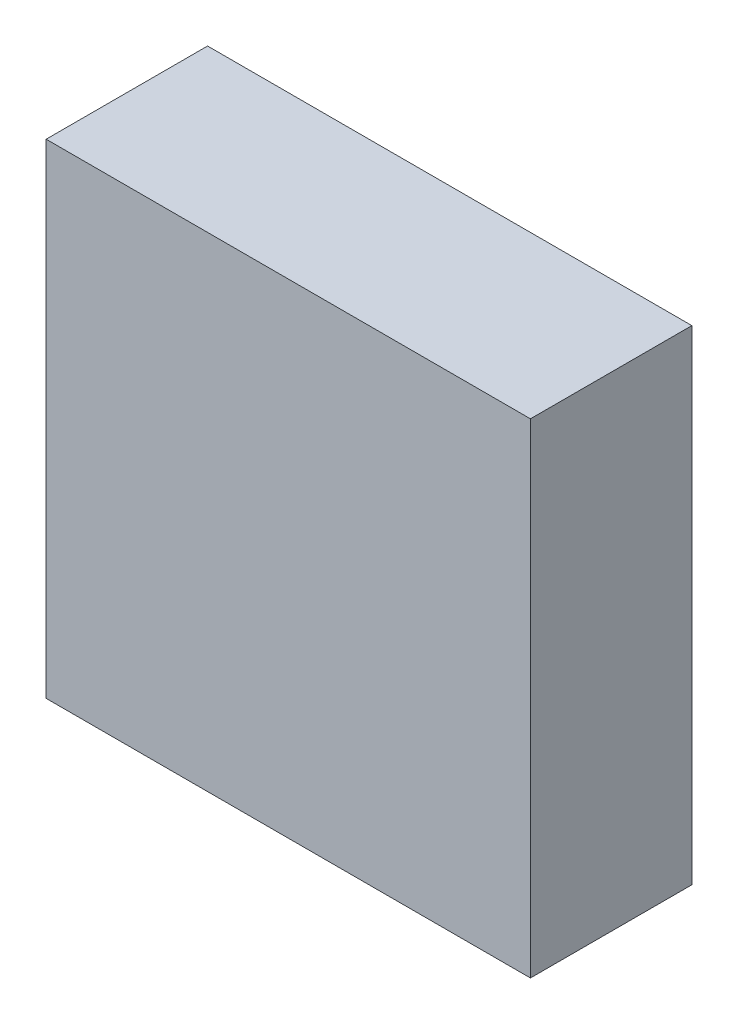
ISO-10303-21;
HEADER;
FILE_DESCRIPTION(('STEP AP214'),'2;1');
FILE_NAME('part.step','',(''),(''),'','','');
FILE_SCHEMA(('AUTOMOTIVE_DESIGN { 1 0 10303 214 1 1 1 1 }'));
ENDSEC;
DATA;
#1=APPLICATION_CONTEXT('core data for automotive mechanical design processes');
#2=APPLICATION_PROTOCOL_DEFINITION('international standard','automotive_design',2000,#1);
#3=PRODUCT_CONTEXT('',#1,'mechanical');
#4=PRODUCT('Part','Part','',(#3));
#5=PRODUCT_RELATED_PRODUCT_CATEGORY('part','',(#4));
#6=PRODUCT_DEFINITION_FORMATION('','',#4);
#7=PRODUCT_DEFINITION_CONTEXT('part definition',#1,'design');
#8=PRODUCT_DEFINITION('design','',#6,#7);
#9=PRODUCT_DEFINITION_SHAPE('','',#8);
#10=(LENGTH_UNIT() NAMED_UNIT(*) SI_UNIT(.MILLI.,.METRE.));
#11=(NAMED_UNIT(*) PLANE_ANGLE_UNIT() SI_UNIT($,.RADIAN.));
#12=(NAMED_UNIT(*) SI_UNIT($,.STERADIAN.) SOLID_ANGLE_UNIT());
#13=UNCERTAINTY_MEASURE_WITH_UNIT(LENGTH_MEASURE(1.E-05),#10,'distance_accuracy_value','');
#14=(GEOMETRIC_REPRESENTATION_CONTEXT(3) GLOBAL_UNCERTAINTY_ASSIGNED_CONTEXT((#13)) GLOBAL_UNIT_ASSIGNED_CONTEXT((#10,
#11,#12)) REPRESENTATION_CONTEXT('',''));
#15=CARTESIAN_POINT('',(0.,0.,0.));
#16=DIRECTION('',(0.,0.,1.));
#17=DIRECTION('',(1.,0.,0.));
#18=AXIS2_PLACEMENT_3D('',#15,#16,#17);
#19=CARTESIAN_POINT('',(-228.197674418605,20.7848837209302,100.));
#20=DIRECTION('',(1.,0.,0.));
#21=DIRECTION('',(0.,1.,0.));
#22=AXIS2_PLACEMENT_3D('',#19,#20,#21);
#23=PLANE('',#22);
#24=DIRECTION('',(0.,-1.,0.));
#25=VECTOR('',#24,1.);
#26=CARTESIAN_POINT('',(-228.197674418605,20.7848837209302,0.));
#27=LINE('',#26,#25);
#28=CARTESIAN_POINT('',(-228.197674418605,20.7848837209302,0.));
#29=VERTEX_POINT('',#28);
#30=CARTESIAN_POINT('',(-228.197674418605,-279.21511627907,0.));
#31=VERTEX_POINT('',#30);
#32=EDGE_CURVE('E102',#29,#31,#27,.T.);
#33=ORIENTED_EDGE('',*,*,#32,.T.);
#34=DIRECTION('',(0.,0.,-1.));
#35=VECTOR('',#34,1.);
#36=CARTESIAN_POINT('',(-228.197674418605,-279.21511627907,100.));
#37=LINE('',#36,#35);
#38=CARTESIAN_POINT('',(-228.197674418605,-279.21511627907,100.));
#39=VERTEX_POINT('',#38);
#40=EDGE_CURVE('E11',#39,#31,#37,.T.);
#41=ORIENTED_EDGE('',*,*,#40,.F.);
#42=DIRECTION('',(0.,-1.,0.));
#43=VECTOR('',#42,1.);
#44=CARTESIAN_POINT('',(-228.197674418605,20.7848837209302,100.));
#45=LINE('',#44,#43);
#46=CARTESIAN_POINT('',(-228.197674418605,20.7848837209302,100.));
#47=VERTEX_POINT('',#46);
#48=EDGE_CURVE('E90',#47,#39,#45,.T.);
#49=ORIENTED_EDGE('',*,*,#48,.F.);
#50=DIRECTION('',(0.,0.,-1.));
#51=VECTOR('',#50,1.);
#52=CARTESIAN_POINT('',(-228.197674418605,20.7848837209302,100.));
#53=LINE('',#52,#51);
#54=EDGE_CURVE('E98',#47,#29,#53,.T.);
#55=ORIENTED_EDGE('',*,*,#54,.T.);
#56=EDGE_LOOP('',(#33,#41,#49,#55));
#57=FACE_BOUND('',#56,.T.);
#58=ADVANCED_FACE('F39',(#57),#23,.F.);
#59=CARTESIAN_POINT('',(-228.197674418605,-279.21511627907,100.));
#60=DIRECTION('',(0.,1.,0.));
#61=DIRECTION('',(0.,0.,1.));
#62=AXIS2_PLACEMENT_3D('',#59,#60,#61);
#63=PLANE('',#62);
#64=DIRECTION('',(1.,0.,0.));
#65=VECTOR('',#64,1.);
#66=CARTESIAN_POINT('',(-228.197674418605,-279.21511627907,0.));
#67=LINE('',#66,#65);
#68=CARTESIAN_POINT('',(71.8023255813954,-279.21511627907,0.));
#69=VERTEX_POINT('',#68);
#70=EDGE_CURVE('E94',#31,#69,#67,.T.);
#71=ORIENTED_EDGE('',*,*,#70,.T.);
#72=DIRECTION('',(0.,0.,-1.));
#73=VECTOR('',#72,1.);
#74=CARTESIAN_POINT('',(71.8023255813954,-279.21511627907,100.));
#75=LINE('',#74,#73);
#76=CARTESIAN_POINT('',(71.8023255813954,-279.21511627907,100.));
#77=VERTEX_POINT('',#76);
#78=EDGE_CURVE('E47',#77,#69,#75,.T.);
#79=ORIENTED_EDGE('',*,*,#78,.F.);
#80=DIRECTION('',(1.,0.,0.));
#81=VECTOR('',#80,1.);
#82=CARTESIAN_POINT('',(-228.197674418605,-279.21511627907,100.));
#83=LINE('',#82,#81);
#84=EDGE_CURVE('E85',#39,#77,#83,.T.);
#85=ORIENTED_EDGE('',*,*,#84,.F.);
#86=ORIENTED_EDGE('',*,*,#40,.T.);
#87=EDGE_LOOP('',(#71,#79,#85,#86));
#88=FACE_BOUND('',#87,.T.);
#89=ADVANCED_FACE('F93',(#88),#63,.F.);
#90=CARTESIAN_POINT('',(71.8023255813954,20.7848837209302,100.));
#91=DIRECTION('',(-1.,0.,0.));
#92=DIRECTION('',(0.,-1.,0.));
#93=AXIS2_PLACEMENT_3D('',#90,#91,#92);
#94=PLANE('',#93);
#95=DIRECTION('',(0.,1.,0.));
#96=VECTOR('',#95,1.);
#97=CARTESIAN_POINT('',(71.8023255813954,20.7848837209302,0.));
#98=LINE('',#97,#96);
#99=CARTESIAN_POINT('',(71.8023255813954,20.7848837209302,0.));
#100=VERTEX_POINT('',#99);
#101=EDGE_CURVE('E72',#69,#100,#98,.T.);
#102=ORIENTED_EDGE('',*,*,#101,.T.);
#103=DIRECTION('',(0.,0.,-1.));
#104=VECTOR('',#103,1.);
#105=CARTESIAN_POINT('',(71.8023255813954,20.7848837209302,100.));
#106=LINE('',#105,#104);
#107=CARTESIAN_POINT('',(71.8023255813954,20.7848837209302,100.));
#108=VERTEX_POINT('',#107);
#109=EDGE_CURVE('E95',#108,#100,#106,.T.);
#110=ORIENTED_EDGE('',*,*,#109,.F.);
#111=DIRECTION('',(0.,1.,0.));
#112=VECTOR('',#111,1.);
#113=CARTESIAN_POINT('',(71.8023255813954,20.7848837209302,100.));
#114=LINE('',#113,#112);
#115=EDGE_CURVE('E88',#77,#108,#114,.T.);
#116=ORIENTED_EDGE('',*,*,#115,.F.);
#117=ORIENTED_EDGE('',*,*,#78,.T.);
#118=EDGE_LOOP('',(#102,#110,#116,#117));
#119=FACE_BOUND('',#118,.T.);
#120=ADVANCED_FACE('F96',(#119),#94,.F.);
#121=CARTESIAN_POINT('',(-228.197674418605,20.7848837209302,100.));
#122=DIRECTION('',(0.,-1.,0.));
#123=DIRECTION('',(0.,0.,-1.));
#124=AXIS2_PLACEMENT_3D('',#121,#122,#123);
#125=PLANE('',#124);
#126=DIRECTION('',(-1.,0.,0.));
#127=VECTOR('',#126,1.);
#128=CARTESIAN_POINT('',(-228.197674418605,20.7848837209302,0.));
#129=LINE('',#128,#127);
#130=EDGE_CURVE('E78',#100,#29,#129,.T.);
#131=ORIENTED_EDGE('',*,*,#130,.T.);
#132=ORIENTED_EDGE('',*,*,#54,.F.);
#133=DIRECTION('',(-1.,0.,0.));
#134=VECTOR('',#133,1.);
#135=CARTESIAN_POINT('',(-228.197674418605,20.7848837209302,100.));
#136=LINE('',#135,#134);
#137=EDGE_CURVE('E55',#108,#47,#136,.T.);
#138=ORIENTED_EDGE('',*,*,#137,.F.);
#139=ORIENTED_EDGE('',*,*,#109,.T.);
#140=EDGE_LOOP('',(#131,#132,#138,#139));
#141=FACE_BOUND('',#140,.T.);
#142=ADVANCED_FACE('F109',(#141),#125,.F.);
#143=CARTESIAN_POINT('',(0.,0.,100.));
#144=DIRECTION('',(0.,0.,1.));
#145=DIRECTION('',(1.,0.,0.));
#146=AXIS2_PLACEMENT_3D('',#143,#144,#145);
#147=PLANE('',#146);
#148=ORIENTED_EDGE('',*,*,#48,.T.);
#149=ORIENTED_EDGE('',*,*,#84,.T.);
#150=ORIENTED_EDGE('',*,*,#115,.T.);
#151=ORIENTED_EDGE('',*,*,#137,.T.);
#152=EDGE_LOOP('',(#148,#149,#150,#151));
#153=FACE_BOUND('',#152,.T.);
#154=ADVANCED_FACE('F86',(#153),#147,.T.);
#155=CARTESIAN_POINT('',(0.,0.,0.));
#156=DIRECTION('',(0.,0.,1.));
#157=DIRECTION('',(1.,0.,0.));
#158=AXIS2_PLACEMENT_3D('',#155,#156,#157);
#159=PLANE('',#158);
#160=ORIENTED_EDGE('',*,*,#32,.F.);
#161=ORIENTED_EDGE('',*,*,#130,.F.);
#162=ORIENTED_EDGE('',*,*,#101,.F.);
#163=ORIENTED_EDGE('',*,*,#70,.F.);
#164=EDGE_LOOP('',(#160,#161,#162,#163));
#165=FACE_BOUND('',#164,.T.);
#166=ADVANCED_FACE('F112',(#165),#159,.F.);
#167=CLOSED_SHELL('',(#58,#89,#120,#142,#154,#166));
#168=MANIFOLD_SOLID_BREP('B2',#167);
#169=ADVANCED_BREP_SHAPE_REPRESENTATION('',(#18,#168),#14);
#170=SHAPE_DEFINITION_REPRESENTATION(#9,#169);
ENDSEC;
END-ISO-10303-21;
